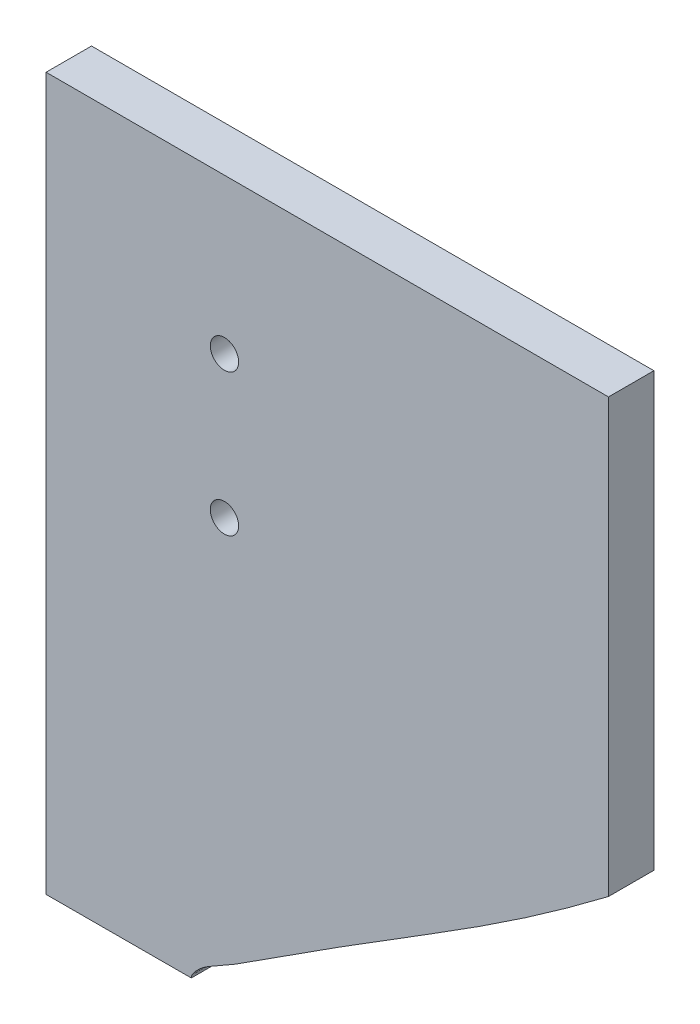
ISO-10303-21;
HEADER;
FILE_DESCRIPTION(('STEP AP214'),'2;1');
FILE_NAME('part.step','',(''),(''),'','','');
FILE_SCHEMA(('AUTOMOTIVE_DESIGN { 1 0 10303 214 1 1 1 1 }'));
ENDSEC;
DATA;
#1=APPLICATION_CONTEXT('core data for automotive mechanical design processes');
#2=APPLICATION_PROTOCOL_DEFINITION('international standard','automotive_design',2000,#1);
#3=PRODUCT_CONTEXT('',#1,'mechanical');
#4=PRODUCT('Part','Part','',(#3));
#5=PRODUCT_RELATED_PRODUCT_CATEGORY('part','',(#4));
#6=PRODUCT_DEFINITION_FORMATION('','',#4);
#7=PRODUCT_DEFINITION_CONTEXT('part definition',#1,'design');
#8=PRODUCT_DEFINITION('design','',#6,#7);
#9=PRODUCT_DEFINITION_SHAPE('','',#8);
#10=(LENGTH_UNIT() NAMED_UNIT(*) SI_UNIT(.MILLI.,.METRE.));
#11=(NAMED_UNIT(*) PLANE_ANGLE_UNIT() SI_UNIT($,.RADIAN.));
#12=(NAMED_UNIT(*) SI_UNIT($,.STERADIAN.) SOLID_ANGLE_UNIT());
#13=UNCERTAINTY_MEASURE_WITH_UNIT(LENGTH_MEASURE(1.E-05),#10,'distance_accuracy_value','');
#14=(GEOMETRIC_REPRESENTATION_CONTEXT(3) GLOBAL_UNCERTAINTY_ASSIGNED_CONTEXT((#13)) GLOBAL_UNIT_ASSIGNED_CONTEXT((#10,
#11,#12)) REPRESENTATION_CONTEXT('',''));
#15=CARTESIAN_POINT('',(0.,0.,0.));
#16=DIRECTION('',(0.,0.,1.));
#17=DIRECTION('',(1.,0.,0.));
#18=AXIS2_PLACEMENT_3D('',#15,#16,#17);
#19=CARTESIAN_POINT('',(-69.1284145370193,-98.7192844509455,67.9999999999997));
#20=DIRECTION('',(0.,0.,1.));
#21=DIRECTION('',(1.,0.,0.));
#22=AXIS2_PLACEMENT_3D('',#19,#20,#21);
#23=PLANE('',#22);
#24=CARTESIAN_POINT('',(-100.,-50.,67.9999999999997));
#25=DIRECTION('',(0.,0.,1.));
#26=DIRECTION('',(1.,0.,0.));
#27=AXIS2_PLACEMENT_3D('',#24,#25,#26);
#28=CIRCLE('',#27,2.5);
#29=CARTESIAN_POINT('',(-97.5,-50.,67.9999999999997));
#30=VERTEX_POINT('',#29);
#31=EDGE_CURVE('E213',#30,#30,#28,.F.);
#32=ORIENTED_EDGE('',*,*,#31,.F.);
#33=EDGE_LOOP('',(#32));
#34=FACE_BOUND('',#33,.T.);
#35=CARTESIAN_POINT('',(-105.838941742703,-123.127345234189,67.9999999999997));
#36=CARTESIAN_POINT('',(-105.842119161489,-123.090000358324,67.9999999999997));
#37=CARTESIAN_POINT('',(-105.848682937521,-123.012854908619,67.9999999999997));
#38=CARTESIAN_POINT('',(-105.831476706608,-122.905410980226,67.9999999999997));
#39=CARTESIAN_POINT('',(-105.802803714649,-122.805052382985,67.9999999999997));
#40=CARTESIAN_POINT('',(-105.755167393118,-122.684870848106,67.9999999999997));
#41=CARTESIAN_POINT('',(-105.653854446538,-122.492650306342,67.9999999999997));
#42=CARTESIAN_POINT('',(-105.475529761408,-122.227393823007,67.9999999999997));
#43=CARTESIAN_POINT('',(-105.181716420962,-121.842093211259,67.9999999999997));
#44=CARTESIAN_POINT('',(-104.75685387709,-121.35553412222,67.9999999999997));
#45=CARTESIAN_POINT('',(-104.21883963509,-120.84527776527,67.9999999999997));
#46=CARTESIAN_POINT('',(-103.59744429477,-120.366566962074,67.9999999999997));
#47=CARTESIAN_POINT('',(-102.756228657122,-119.806928363445,67.9999999999997));
#48=CARTESIAN_POINT('',(-101.640110312817,-119.168116167103,67.9999999999997));
#49=CARTESIAN_POINT('',(-100.308241957847,-118.440371811543,67.9999999999997));
#50=CARTESIAN_POINT('',(-98.9849919943361,-117.695429329136,67.9999999999997));
#51=CARTESIAN_POINT('',(-97.6900274395753,-116.903467276117,67.9999999999997));
#52=CARTESIAN_POINT('',(-96.4142769076993,-116.081997493039,67.9999999999997));
#53=CARTESIAN_POINT('',(-94.7160607868147,-114.982347065192,67.9999999999997));
#54=CARTESIAN_POINT('',(-92.5895030629305,-113.61356809142,67.9999999999997));
#55=CARTESIAN_POINT('',(-90.0386150078947,-111.969513773992,67.9999999999997));
#56=CARTESIAN_POINT('',(-87.4905123456814,-110.321112108077,67.9999999999997));
#57=CARTESIAN_POINT('',(-84.9408470042681,-108.675089240336,67.9999999999997));
#58=CARTESIAN_POINT('',(-81.5323465150368,-106.494309753968,67.9999999999997));
#59=CARTESIAN_POINT('',(-77.2255084150575,-103.769770641043,67.9999999999997));
#60=CARTESIAN_POINT('',(-72.0791273688077,-100.55176279525,67.9999999999997));
#61=CARTESIAN_POINT('',(-66.92300025786,-97.3495021409576,67.9999999999997));
#62=CARTESIAN_POINT('',(-61.8022548338988,-94.163004291377,67.9999999999997));
#63=CARTESIAN_POINT('',(-56.6717791642997,-90.9203208518644,67.9999999999997));
#64=CARTESIAN_POINT('',(-51.5822758374977,-87.6130115200649,67.9999999999997));
#65=CARTESIAN_POINT('',(-46.5456482220716,-84.2254160905753,67.9999999999997));
#66=CARTESIAN_POINT('',(-42.3981694373643,-81.3299330558763,67.9999999999997));
#67=CARTESIAN_POINT('',(-39.1110523304909,-78.9712232578234,67.9999999999997));
#68=CARTESIAN_POINT('',(-36.9587112319455,-77.3993129334412,67.9999999999997));
#69=CARTESIAN_POINT('',(-35.1491052602695,-76.058947322814,67.9999999999997));
#70=CARTESIAN_POINT('',(-33.7128540827196,-74.9850052312302,67.9999999999997));
#71=CARTESIAN_POINT('',(-32.794939733175,-74.2909018176718,67.9999999999997));
#72=CARTESIAN_POINT('',(-32.3540771665585,-73.9575327919556,67.9999999999997));
#73=B_SPLINE_CURVE_WITH_KNOTS('',3,(#35,#36,#37,#38,#39,#40,#41,#42,#43,#44,#45,#46,#47,#48,#49,
#50,#51,#52,#53,#54,#55,#56,#57,#58,#59,#60,#61,#62,#63,#64,#65,#66,#67,#68,#69,#70,#71,#72),
.UNSPECIFIED.,.F.,.F.,(4,1,1,1,1,1,1,1,1,1,1,1,1,1,1,1,1,1,1,1,1,1,1,1,1,1,1,1,1,1,1,1,1,1,1,4),
(0.,0.00126360166704675,0.00261029436023352,0.00364777289972851,0.0047920945076233,
0.0069749268284891,0.0109815123309923,0.0155854549809407,0.0233577323395275,0.0328013377812012,
0.0406087495290958,0.0498579988831287,0.0669500840629744,0.0840759641339057,0.101193116516666,
0.118297405359271,0.135402068253626,0.152508045560428,0.18671926462344,0.220930523766335,
0.2551423339047,0.289354156200363,0.323566001427249,0.391989518695691,0.461705015290908,
0.528836836007759,0.597259057480984,0.665676554272931,0.73409371261584,0.802524696142685,
0.870945749073291,0.905148762323695,0.939349956044617,0.96108078071367,0.981307594860245,1.),.UNSPECIFIED.);
#74=CARTESIAN_POINT('',(-105.838942021079,-123.127345227961,67.9999999999997));
#75=VERTEX_POINT('',#74);
#76=CARTESIAN_POINT('',(-32.354077166528,-73.957532791934,67.9999999999997));
#77=VERTEX_POINT('',#76);
#78=EDGE_CURVE('E107',#75,#77,#73,.T.);
#79=ORIENTED_EDGE('',*,*,#78,.F.);
#80=CARTESIAN_POINT('',(-131.415537528343,-123.168289965217,67.9999999999997));
#81=CARTESIAN_POINT('',(-127.590271899843,-123.16249011336,67.9999999999997));
#82=CARTESIAN_POINT('',(-119.064738912552,-123.149563727255,67.9999999999997));
#83=CARTESIAN_POINT('',(-110.539208152153,-123.135241376721,67.9999999999997));
#84=CARTESIAN_POINT('',(-105.838942021079,-123.127345227961,67.9999999999997));
#85=B_SPLINE_CURVE_WITH_KNOTS('',3,(#80,#81,#82,#83,#84),.UNSPECIFIED.,.F.,.F.,(4,1,4),
(6.0181402047476E-06,0.44868677665843,1.),.UNSPECIFIED.);
#86=CARTESIAN_POINT('',(-131.415537528343,-123.168289965217,67.9999999999997));
#87=VERTEX_POINT('',#86);
#88=EDGE_CURVE('E101',#87,#75,#85,.T.);
#89=ORIENTED_EDGE('',*,*,#88,.F.);
#90=DIRECTION('',(-2.27677647156274E-07,-0.999999999999974,0.));
#91=VECTOR('',#90,1.);
#92=CARTESIAN_POINT('',(-131.415508972036,2.25600000000005,67.9999999999997));
#93=LINE('',#92,#91);
#94=CARTESIAN_POINT('',(-131.415508972036,2.25600000000005,67.9999999999997));
#95=VERTEX_POINT('',#94);
#96=EDGE_CURVE('E88',#95,#87,#93,.T.);
#97=ORIENTED_EDGE('',*,*,#96,.F.);
#98=DIRECTION('',(-1.,0.,0.));
#99=VECTOR('',#98,1.);
#100=CARTESIAN_POINT('',(-131.415508972036,2.25600000000005,67.9999999999997));
#101=LINE('',#100,#99);
#102=CARTESIAN_POINT('',(-32.3544297950227,2.25600000000004,67.9999999999997));
#103=VERTEX_POINT('',#102);
#104=EDGE_CURVE('E100',#103,#95,#101,.T.);
#105=ORIENTED_EDGE('',*,*,#104,.F.);
#106=DIRECTION('',(-4.62684882567661E-06,0.999999999989296,0.));
#107=VECTOR('',#106,1.);
#108=CARTESIAN_POINT('',(-32.3544297950227,2.25600000000004,67.9999999999997));
#109=LINE('',#108,#107);
#110=EDGE_CURVE('E105',#77,#103,#109,.T.);
#111=ORIENTED_EDGE('',*,*,#110,.F.);
#112=EDGE_LOOP('',(#79,#89,#97,#105,#111));
#113=FACE_BOUND('',#112,.T.);
#114=CARTESIAN_POINT('',(-100.,-25.,67.9999999999997));
#115=DIRECTION('',(0.,0.,1.));
#116=DIRECTION('',(1.,0.,0.));
#117=AXIS2_PLACEMENT_3D('',#114,#115,#116);
#118=CIRCLE('',#117,2.5);
#119=CARTESIAN_POINT('',(-97.5,-25.,67.9999999999997));
#120=VERTEX_POINT('',#119);
#121=EDGE_CURVE('E221',#120,#120,#118,.F.);
#122=ORIENTED_EDGE('',*,*,#121,.F.);
#123=EDGE_LOOP('',(#122));
#124=FACE_BOUND('',#123,.T.);
#125=ADVANCED_FACE('F30',(#34,#113,#124),#23,.F.);
#126=CARTESIAN_POINT('',(-69.1284145370193,-98.7192844509455,75.9999999999997));
#127=DIRECTION('',(0.,0.,1.));
#128=DIRECTION('',(1.,0.,0.));
#129=AXIS2_PLACEMENT_3D('',#126,#127,#128);
#130=PLANE('',#129);
#131=CARTESIAN_POINT('',(-100.,-50.,75.9999999999997));
#132=DIRECTION('',(0.,0.,1.));
#133=DIRECTION('',(1.,0.,0.));
#134=AXIS2_PLACEMENT_3D('',#131,#132,#133);
#135=CIRCLE('',#134,2.5);
#136=CARTESIAN_POINT('',(-97.5,-50.,75.9999999999997));
#137=VERTEX_POINT('',#136);
#138=EDGE_CURVE('E219',#137,#137,#135,.F.);
#139=ORIENTED_EDGE('',*,*,#138,.T.);
#140=EDGE_LOOP('',(#139));
#141=FACE_BOUND('',#140,.T.);
#142=CARTESIAN_POINT('',(-32.3540771665585,-73.9575327919556,75.9999999999997));
#143=CARTESIAN_POINT('',(-32.794939733175,-74.2909018176718,75.9999999999997));
#144=CARTESIAN_POINT('',(-33.7128540827196,-74.9850052312302,75.9999999999997));
#145=CARTESIAN_POINT('',(-35.1491052602695,-76.058947322814,75.9999999999997));
#146=CARTESIAN_POINT('',(-36.9587112319455,-77.3993129334412,75.9999999999997));
#147=CARTESIAN_POINT('',(-39.1110523304909,-78.9712232578234,75.9999999999997));
#148=CARTESIAN_POINT('',(-42.3981694373643,-81.3299330558763,75.9999999999997));
#149=CARTESIAN_POINT('',(-46.5456482220716,-84.2254160905753,75.9999999999997));
#150=CARTESIAN_POINT('',(-51.5822758374977,-87.6130115200649,75.9999999999997));
#151=CARTESIAN_POINT('',(-56.6717791642997,-90.9203208518644,75.9999999999997));
#152=CARTESIAN_POINT('',(-61.8022548338988,-94.163004291377,75.9999999999997));
#153=CARTESIAN_POINT('',(-66.92300025786,-97.3495021409576,75.9999999999997));
#154=CARTESIAN_POINT('',(-72.0791273688077,-100.55176279525,75.9999999999997));
#155=CARTESIAN_POINT('',(-77.2255084150575,-103.769770641043,75.9999999999997));
#156=CARTESIAN_POINT('',(-81.5323465150368,-106.494309753968,75.9999999999997));
#157=CARTESIAN_POINT('',(-84.9408470042681,-108.675089240336,75.9999999999997));
#158=CARTESIAN_POINT('',(-87.4905123456814,-110.321112108077,75.9999999999997));
#159=CARTESIAN_POINT('',(-90.0386150078947,-111.969513773992,75.9999999999997));
#160=CARTESIAN_POINT('',(-92.5895030629305,-113.61356809142,75.9999999999997));
#161=CARTESIAN_POINT('',(-94.7160607868147,-114.982347065192,75.9999999999997));
#162=CARTESIAN_POINT('',(-96.4142769076993,-116.081997493039,75.9999999999997));
#163=CARTESIAN_POINT('',(-97.6900274395753,-116.903467276117,75.9999999999997));
#164=CARTESIAN_POINT('',(-98.9849919943361,-117.695429329136,75.9999999999997));
#165=CARTESIAN_POINT('',(-100.308241957847,-118.440371811543,75.9999999999997));
#166=CARTESIAN_POINT('',(-101.640110312817,-119.168116167103,75.9999999999997));
#167=CARTESIAN_POINT('',(-102.756228657122,-119.806928363445,75.9999999999997));
#168=CARTESIAN_POINT('',(-103.59744429477,-120.366566962074,75.9999999999997));
#169=CARTESIAN_POINT('',(-104.21883963509,-120.84527776527,75.9999999999997));
#170=CARTESIAN_POINT('',(-104.75685387709,-121.35553412222,75.9999999999997));
#171=CARTESIAN_POINT('',(-105.181716420962,-121.842093211259,75.9999999999997));
#172=CARTESIAN_POINT('',(-105.475529761408,-122.227393823007,75.9999999999997));
#173=CARTESIAN_POINT('',(-105.653854446538,-122.492650306342,75.9999999999997));
#174=CARTESIAN_POINT('',(-105.755167393118,-122.684870848106,75.9999999999997));
#175=CARTESIAN_POINT('',(-105.802803714649,-122.805052382985,75.9999999999997));
#176=CARTESIAN_POINT('',(-105.831476706608,-122.905410980226,75.9999999999997));
#177=CARTESIAN_POINT('',(-105.848682937521,-123.012854908619,75.9999999999997));
#178=CARTESIAN_POINT('',(-105.842119161489,-123.090000358324,75.9999999999997));
#179=CARTESIAN_POINT('',(-105.838941742703,-123.127345234189,75.9999999999997));
#180=B_SPLINE_CURVE_WITH_KNOTS('',3,(#142,#143,#144,#145,#146,#147,#148,#149,#150,#151,#152,
#153,#154,#155,#156,#157,#158,#159,#160,#161,#162,#163,#164,#165,#166,#167,#168,#169,#170,#171,
#172,#173,#174,#175,#176,#177,#178,#179),.UNSPECIFIED.,.F.,.F.,(4,1,1,1,1,1,1,1,1,1,1,1,1,1,1,1,
1,1,1,1,1,1,1,1,1,1,1,1,1,1,1,1,1,1,1,4),(0.,0.0186924051397546,0.0389192192863298,
0.0606500439553832,0.0948512376763051,0.129054250926709,0.197475303857315,0.26590628738416,
0.334323445727069,0.402740942519016,0.471163163992241,0.538294984709092,0.608010481304309,
0.676433998572751,0.710645843799637,0.7448576660953,0.779069476233665,0.81328073537656,
0.847491954439572,0.864597931746374,0.881702594640729,0.898806883483334,0.915924035866094,
0.933049915937026,0.950142001116871,0.959391250470904,0.967198662218799,0.976642267660472,
0.984414545019059,0.989018487669008,0.993025073171511,0.995207905492377,0.996352227100271,
0.997389705639766,0.998736398332953,1.),.UNSPECIFIED.);
#181=CARTESIAN_POINT('',(-105.838942021079,-123.127345227961,75.9999999999997));
#182=VERTEX_POINT('',#181);
#183=CARTESIAN_POINT('',(-32.354077166528,-73.957532791934,75.9999999999997));
#184=VERTEX_POINT('',#183);
#185=EDGE_CURVE('E206',#182,#184,#180,.F.);
#186=ORIENTED_EDGE('',*,*,#185,.T.);
#187=DIRECTION('',(-4.62684882567661E-06,0.999999999989296,0.));
#188=VECTOR('',#187,1.);
#189=CARTESIAN_POINT('',(-32.3544297950227,2.25600000000004,75.9999999999997));
#190=LINE('',#189,#188);
#191=CARTESIAN_POINT('',(-32.3544297950227,2.25600000000004,75.9999999999997));
#192=VERTEX_POINT('',#191);
#193=EDGE_CURVE('E210',#184,#192,#190,.T.);
#194=ORIENTED_EDGE('',*,*,#193,.T.);
#195=DIRECTION('',(-1.,0.,0.));
#196=VECTOR('',#195,1.);
#197=CARTESIAN_POINT('',(-131.415508972036,2.25600000000005,75.9999999999997));
#198=LINE('',#197,#196);
#199=CARTESIAN_POINT('',(-131.415508972036,2.25600000000005,75.9999999999997));
#200=VERTEX_POINT('',#199);
#201=EDGE_CURVE('E118',#192,#200,#198,.T.);
#202=ORIENTED_EDGE('',*,*,#201,.T.);
#203=DIRECTION('',(-2.27677647156274E-07,-0.999999999999974,0.));
#204=VECTOR('',#203,1.);
#205=CARTESIAN_POINT('',(-131.415508972036,2.25600000000005,75.9999999999997));
#206=LINE('',#205,#204);
#207=CARTESIAN_POINT('',(-131.415537528343,-123.168289965217,75.9999999999997));
#208=VERTEX_POINT('',#207);
#209=EDGE_CURVE('E90',#200,#208,#206,.T.);
#210=ORIENTED_EDGE('',*,*,#209,.T.);
#211=CARTESIAN_POINT('',(-105.838942021079,-123.127345227961,75.9999999999997));
#212=CARTESIAN_POINT('',(-110.539208152153,-123.135241376721,75.9999999999997));
#213=CARTESIAN_POINT('',(-119.064738912552,-123.149563727255,75.9999999999997));
#214=CARTESIAN_POINT('',(-127.590271899843,-123.16249011336,75.9999999999997));
#215=CARTESIAN_POINT('',(-131.415537528343,-123.168289965217,75.9999999999997));
#216=B_SPLINE_CURVE_WITH_KNOTS('',3,(#211,#212,#213,#214,#215),.UNSPECIFIED.,.F.,.F.,(4,1,4),
(6.01814020484426E-06,0.551319241481775,1.),.UNSPECIFIED.);
#217=EDGE_CURVE('E149',#208,#182,#216,.F.);
#218=ORIENTED_EDGE('',*,*,#217,.T.);
#219=EDGE_LOOP('',(#186,#194,#202,#210,#218));
#220=FACE_BOUND('',#219,.T.);
#221=CARTESIAN_POINT('',(-100.,-25.,75.9999999999997));
#222=DIRECTION('',(0.,0.,1.));
#223=DIRECTION('',(1.,0.,0.));
#224=AXIS2_PLACEMENT_3D('',#221,#222,#223);
#225=CIRCLE('',#224,2.5);
#226=CARTESIAN_POINT('',(-97.5,-25.,75.9999999999997));
#227=VERTEX_POINT('',#226);
#228=EDGE_CURVE('E36',#227,#227,#225,.F.);
#229=ORIENTED_EDGE('',*,*,#228,.T.);
#230=EDGE_LOOP('',(#229));
#231=FACE_BOUND('',#230,.T.);
#232=ADVANCED_FACE('F128',(#141,#220,#231),#130,.T.);
#233=CARTESIAN_POINT('',(-105.838941742703,-123.127345234189,67.9999999999997));
#234=CARTESIAN_POINT('',(-105.842119161489,-123.090000358324,67.9999999999997));
#235=CARTESIAN_POINT('',(-105.848682937521,-123.012854908619,67.9999999999997));
#236=CARTESIAN_POINT('',(-105.831476706608,-122.905410980226,67.9999999999997));
#237=CARTESIAN_POINT('',(-105.802803714649,-122.805052382985,67.9999999999997));
#238=CARTESIAN_POINT('',(-105.755167393118,-122.684870848106,67.9999999999997));
#239=CARTESIAN_POINT('',(-105.653854446538,-122.492650306342,67.9999999999997));
#240=CARTESIAN_POINT('',(-105.475529761408,-122.227393823007,67.9999999999997));
#241=CARTESIAN_POINT('',(-105.181716420962,-121.842093211259,67.9999999999997));
#242=CARTESIAN_POINT('',(-104.75685387709,-121.35553412222,67.9999999999997));
#243=CARTESIAN_POINT('',(-104.21883963509,-120.84527776527,67.9999999999997));
#244=CARTESIAN_POINT('',(-103.59744429477,-120.366566962074,67.9999999999997));
#245=CARTESIAN_POINT('',(-102.756228657122,-119.806928363445,67.9999999999997));
#246=CARTESIAN_POINT('',(-101.640110312817,-119.168116167103,67.9999999999997));
#247=CARTESIAN_POINT('',(-100.308241957847,-118.440371811543,67.9999999999997));
#248=CARTESIAN_POINT('',(-98.9849919943361,-117.695429329136,67.9999999999997));
#249=CARTESIAN_POINT('',(-97.6900274395753,-116.903467276117,67.9999999999997));
#250=CARTESIAN_POINT('',(-96.4142769076993,-116.081997493039,67.9999999999997));
#251=CARTESIAN_POINT('',(-94.7160607868147,-114.982347065192,67.9999999999997));
#252=CARTESIAN_POINT('',(-92.5895030629305,-113.61356809142,67.9999999999997));
#253=CARTESIAN_POINT('',(-90.0386150078947,-111.969513773992,67.9999999999997));
#254=CARTESIAN_POINT('',(-87.4905123456814,-110.321112108077,67.9999999999997));
#255=CARTESIAN_POINT('',(-84.9408470042681,-108.675089240336,67.9999999999997));
#256=CARTESIAN_POINT('',(-81.5323465150368,-106.494309753968,67.9999999999997));
#257=CARTESIAN_POINT('',(-77.2255084150575,-103.769770641043,67.9999999999997));
#258=CARTESIAN_POINT('',(-72.0791273688077,-100.55176279525,67.9999999999997));
#259=CARTESIAN_POINT('',(-66.92300025786,-97.3495021409576,67.9999999999997));
#260=CARTESIAN_POINT('',(-61.8022548338988,-94.163004291377,67.9999999999997));
#261=CARTESIAN_POINT('',(-56.6717791642997,-90.9203208518644,67.9999999999997));
#262=CARTESIAN_POINT('',(-51.5822758374977,-87.6130115200649,67.9999999999997));
#263=CARTESIAN_POINT('',(-46.5456482220716,-84.2254160905753,67.9999999999997));
#264=CARTESIAN_POINT('',(-42.3981694373643,-81.3299330558763,67.9999999999997));
#265=CARTESIAN_POINT('',(-39.1110523304909,-78.9712232578234,67.9999999999997));
#266=CARTESIAN_POINT('',(-36.9587112319455,-77.3993129334412,67.9999999999997));
#267=CARTESIAN_POINT('',(-35.1491052602695,-76.058947322814,67.9999999999997));
#268=CARTESIAN_POINT('',(-33.7128540827196,-74.9850052312302,67.9999999999997));
#269=CARTESIAN_POINT('',(-32.794939733175,-74.2909018176718,67.9999999999997));
#270=CARTESIAN_POINT('',(-32.3540771665585,-73.9575327919556,67.9999999999997));
#271=B_SPLINE_CURVE_WITH_KNOTS('',3,(#233,#234,#235,#236,#237,#238,#239,#240,#241,#242,#243,
#244,#245,#246,#247,#248,#249,#250,#251,#252,#253,#254,#255,#256,#257,#258,#259,#260,#261,#262,
#263,#264,#265,#266,#267,#268,#269,#270),.UNSPECIFIED.,.F.,.F.,(4,1,1,1,1,1,1,1,1,1,1,1,1,1,1,1,
1,1,1,1,1,1,1,1,1,1,1,1,1,1,1,1,1,1,1,4),(0.,0.00126360166704675,0.00261029436023352,
0.00364777289972851,0.0047920945076233,0.0069749268284891,0.0109815123309923,0.0155854549809407,
0.0233577323395275,0.0328013377812012,0.0406087495290958,0.0498579988831287,0.0669500840629744,
0.0840759641339057,0.101193116516666,0.118297405359271,0.135402068253626,0.152508045560428,
0.18671926462344,0.220930523766335,0.2551423339047,0.289354156200363,0.323566001427249,
0.391989518695691,0.461705015290908,0.528836836007759,0.597259057480984,0.665676554272931,
0.73409371261584,0.802524696142685,0.870945749073291,0.905148762323695,0.939349956044617,
0.96108078071367,0.981307594860245,1.),.UNSPECIFIED.);
#272=DIRECTION('',(0.,0.,1.));
#273=VECTOR('',#272,1.);
#274=SURFACE_OF_LINEAR_EXTRUSION('',#271,#273);
#275=ORIENTED_EDGE('',*,*,#185,.F.);
#276=DIRECTION('',(0.,0.,1.));
#277=VECTOR('',#276,1.);
#278=CARTESIAN_POINT('',(-105.838942021079,-123.127345227961,67.9999999999997));
#279=LINE('',#278,#277);
#280=EDGE_CURVE('E11',#75,#182,#279,.T.);
#281=ORIENTED_EDGE('',*,*,#280,.F.);
#282=ORIENTED_EDGE('',*,*,#78,.T.);
#283=DIRECTION('',(0.,0.,1.));
#284=VECTOR('',#283,1.);
#285=CARTESIAN_POINT('',(-32.354077166528,-73.957532791934,67.9999999999997));
#286=LINE('',#285,#284);
#287=EDGE_CURVE('E80',#77,#184,#286,.T.);
#288=ORIENTED_EDGE('',*,*,#287,.T.);
#289=EDGE_LOOP('',(#275,#281,#282,#288));
#290=FACE_BOUND('',#289,.T.);
#291=ADVANCED_FACE('F32',(#290),#274,.T.);
#292=CARTESIAN_POINT('',(-131.415691452828,-123.168290198597,67.9999999999997));
#293=CARTESIAN_POINT('',(-127.590374516166,-123.162490268946,67.9999999999997));
#294=CARTESIAN_POINT('',(-119.0647902207,-123.14956381345,67.9999999999997));
#295=CARTESIAN_POINT('',(-110.539208152153,-123.135241376721,67.9999999999997));
#296=CARTESIAN_POINT('',(-105.838942021079,-123.127345227961,67.9999999999997));
#297=B_SPLINE_CURVE_WITH_KNOTS('',3,(#292,#293,#294,#295,#296),.UNSPECIFIED.,.F.,.F.,(4,1,4),
(0.,0.44868677665843,1.),.UNSPECIFIED.);
#298=DIRECTION('',(0.,0.,1.));
#299=VECTOR('',#298,1.);
#300=SURFACE_OF_LINEAR_EXTRUSION('',#297,#299);
#301=ORIENTED_EDGE('',*,*,#217,.F.);
#302=DIRECTION('',(0.,0.,1.));
#303=VECTOR('',#302,1.);
#304=CARTESIAN_POINT('',(-131.415537528343,-123.168289965217,67.9999999999997));
#305=LINE('',#304,#303);
#306=EDGE_CURVE('E42',#87,#208,#305,.T.);
#307=ORIENTED_EDGE('',*,*,#306,.F.);
#308=ORIENTED_EDGE('',*,*,#88,.T.);
#309=ORIENTED_EDGE('',*,*,#280,.T.);
#310=EDGE_LOOP('',(#301,#307,#308,#309));
#311=FACE_BOUND('',#310,.T.);
#312=ADVANCED_FACE('F123',(#311),#300,.T.);
#313=CARTESIAN_POINT('',(-131.415508972036,2.25600000000005,67.9999999999997));
#314=DIRECTION('',(-0.999999999999974,2.27677647156274E-07,0.));
#315=DIRECTION('',(-2.27677647156274E-07,-0.999999999999974,0.));
#316=AXIS2_PLACEMENT_3D('',#313,#314,#315);
#317=PLANE('',#316);
#318=ORIENTED_EDGE('',*,*,#209,.F.);
#319=DIRECTION('',(0.,0.,1.));
#320=VECTOR('',#319,1.);
#321=CARTESIAN_POINT('',(-131.415508972036,2.25600000000005,67.9999999999997));
#322=LINE('',#321,#320);
#323=EDGE_CURVE('E85',#95,#200,#322,.T.);
#324=ORIENTED_EDGE('',*,*,#323,.F.);
#325=ORIENTED_EDGE('',*,*,#96,.T.);
#326=ORIENTED_EDGE('',*,*,#306,.T.);
#327=EDGE_LOOP('',(#318,#324,#325,#326));
#328=FACE_BOUND('',#327,.T.);
#329=ADVANCED_FACE('F87',(#328),#317,.T.);
#330=CARTESIAN_POINT('',(-131.415508972036,2.25600000000005,67.9999999999997));
#331=DIRECTION('',(0.,1.,0.));
#332=DIRECTION('',(-1.,0.,0.));
#333=AXIS2_PLACEMENT_3D('',#330,#331,#332);
#334=PLANE('',#333);
#335=ORIENTED_EDGE('',*,*,#201,.F.);
#336=DIRECTION('',(0.,0.,1.));
#337=VECTOR('',#336,1.);
#338=CARTESIAN_POINT('',(-32.3544297950227,2.25600000000004,67.9999999999997));
#339=LINE('',#338,#337);
#340=EDGE_CURVE('E95',#103,#192,#339,.T.);
#341=ORIENTED_EDGE('',*,*,#340,.F.);
#342=ORIENTED_EDGE('',*,*,#104,.T.);
#343=ORIENTED_EDGE('',*,*,#323,.T.);
#344=EDGE_LOOP('',(#335,#341,#342,#343));
#345=FACE_BOUND('',#344,.T.);
#346=ADVANCED_FACE('F104',(#345),#334,.T.);
#347=CARTESIAN_POINT('',(-32.3544297950227,2.25600000000004,67.9999999999997));
#348=DIRECTION('',(0.999999999989296,4.62684882567661E-06,0.));
#349=DIRECTION('',(-4.62684882567661E-06,0.999999999989296,0.));
#350=AXIS2_PLACEMENT_3D('',#347,#348,#349);
#351=PLANE('',#350);
#352=ORIENTED_EDGE('',*,*,#193,.F.);
#353=ORIENTED_EDGE('',*,*,#287,.F.);
#354=ORIENTED_EDGE('',*,*,#110,.T.);
#355=ORIENTED_EDGE('',*,*,#340,.T.);
#356=EDGE_LOOP('',(#352,#353,#354,#355));
#357=FACE_BOUND('',#356,.T.);
#358=ADVANCED_FACE('F211',(#357),#351,.T.);
#359=CARTESIAN_POINT('',(-100.,-50.,308.));
#360=DIRECTION('',(0.,0.,-1.));
#361=DIRECTION('',(-1.,0.,0.));
#362=AXIS2_PLACEMENT_3D('',#359,#360,#361);
#363=CYLINDRICAL_SURFACE('',#362,2.5);
#364=ORIENTED_EDGE('',*,*,#138,.F.);
#365=EDGE_LOOP('',(#364));
#366=FACE_BOUND('',#365,.T.);
#367=ORIENTED_EDGE('',*,*,#31,.T.);
#368=EDGE_LOOP('',(#367));
#369=FACE_BOUND('',#368,.T.);
#370=ADVANCED_FACE('F175',(#366,#369),#363,.F.);
#371=CARTESIAN_POINT('',(-100.,-25.,308.));
#372=DIRECTION('',(0.,0.,-1.));
#373=DIRECTION('',(-1.,0.,0.));
#374=AXIS2_PLACEMENT_3D('',#371,#372,#373);
#375=CYLINDRICAL_SURFACE('',#374,2.5);
#376=ORIENTED_EDGE('',*,*,#228,.F.);
#377=EDGE_LOOP('',(#376));
#378=FACE_BOUND('',#377,.T.);
#379=ORIENTED_EDGE('',*,*,#121,.T.);
#380=EDGE_LOOP('',(#379));
#381=FACE_BOUND('',#380,.T.);
#382=ADVANCED_FACE('F232',(#378,#381),#375,.F.);
#383=CLOSED_SHELL('',(#125,#232,#291,#312,#329,#346,#358,#370,#382));
#384=MANIFOLD_SOLID_BREP('B2',#383);
#385=ADVANCED_BREP_SHAPE_REPRESENTATION('',(#18,#384),#14);
#386=SHAPE_DEFINITION_REPRESENTATION(#9,#385);
ENDSEC;
END-ISO-10303-21;
